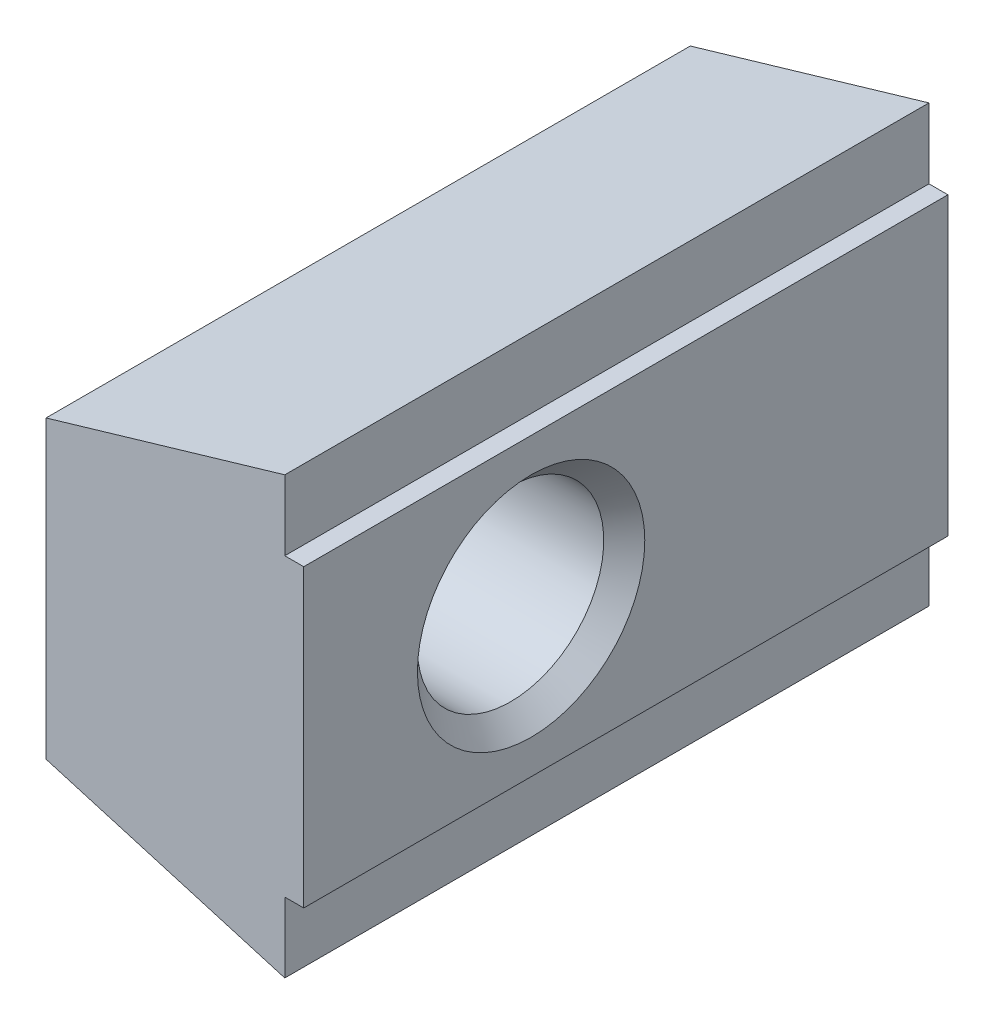
ISO-10303-21;
HEADER;
FILE_DESCRIPTION(('STEP AP214'),'2;1');
FILE_NAME('part.step','',(''),(''),'','','');
FILE_SCHEMA(('AUTOMOTIVE_DESIGN { 1 0 10303 214 1 1 1 1 }'));
ENDSEC;
DATA;
#1=APPLICATION_CONTEXT('core data for automotive mechanical design processes');
#2=APPLICATION_PROTOCOL_DEFINITION('international standard','automotive_design',2000,#1);
#3=PRODUCT_CONTEXT('',#1,'mechanical');
#4=PRODUCT('Part','Part','',(#3));
#5=PRODUCT_RELATED_PRODUCT_CATEGORY('part','',(#4));
#6=PRODUCT_DEFINITION_FORMATION('','',#4);
#7=PRODUCT_DEFINITION_CONTEXT('part definition',#1,'design');
#8=PRODUCT_DEFINITION('design','',#6,#7);
#9=PRODUCT_DEFINITION_SHAPE('','',#8);
#10=(LENGTH_UNIT() NAMED_UNIT(*) SI_UNIT(.MILLI.,.METRE.));
#11=(NAMED_UNIT(*) PLANE_ANGLE_UNIT() SI_UNIT($,.RADIAN.));
#12=(NAMED_UNIT(*) SI_UNIT($,.STERADIAN.) SOLID_ANGLE_UNIT());
#13=UNCERTAINTY_MEASURE_WITH_UNIT(LENGTH_MEASURE(1.E-05),#10,'distance_accuracy_value','');
#14=(GEOMETRIC_REPRESENTATION_CONTEXT(3) GLOBAL_UNCERTAINTY_ASSIGNED_CONTEXT((#13)) GLOBAL_UNIT_ASSIGNED_CONTEXT((#10,
#11,#12)) REPRESENTATION_CONTEXT('',''));
#15=CARTESIAN_POINT('',(0.,0.,0.));
#16=DIRECTION('',(0.,0.,1.));
#17=DIRECTION('',(1.,0.,0.));
#18=AXIS2_PLACEMENT_3D('',#15,#16,#17);
#19=CARTESIAN_POINT('',(0.,-3.9,8.5));
#20=DIRECTION('',(-1.,0.,0.));
#21=DIRECTION('',(0.,1.,0.));
#22=AXIS2_PLACEMENT_3D('',#19,#20,#21);
#23=PLANE('',#22);
#24=DIRECTION('',(0.,-1.,0.));
#25=VECTOR('',#24,1.);
#26=CARTESIAN_POINT('',(0.,3.9,-8.5));
#27=LINE('',#26,#25);
#28=CARTESIAN_POINT('',(0.,3.9,-8.5));
#29=VERTEX_POINT('',#28);
#30=CARTESIAN_POINT('',(0.,-3.9,-8.5));
#31=VERTEX_POINT('',#30);
#32=EDGE_CURVE('E88',#29,#31,#27,.T.);
#33=ORIENTED_EDGE('',*,*,#32,.T.);
#34=DIRECTION('',(0.,0.,1.));
#35=VECTOR('',#34,1.);
#36=CARTESIAN_POINT('',(0.,-3.9,-8.5));
#37=LINE('',#36,#35);
#38=CARTESIAN_POINT('',(0.,-3.9,8.5));
#39=VERTEX_POINT('',#38);
#40=EDGE_CURVE('E103',#39,#31,#37,.F.);
#41=ORIENTED_EDGE('',*,*,#40,.F.);
#42=DIRECTION('',(0.,1.,0.));
#43=VECTOR('',#42,1.);
#44=CARTESIAN_POINT('',(0.,-3.9,8.5));
#45=LINE('',#44,#43);
#46=CARTESIAN_POINT('',(0.,3.9,8.5));
#47=VERTEX_POINT('',#46);
#48=EDGE_CURVE('E110',#47,#39,#45,.F.);
#49=ORIENTED_EDGE('',*,*,#48,.F.);
#50=DIRECTION('',(0.,0.,-1.));
#51=VECTOR('',#50,1.);
#52=CARTESIAN_POINT('',(0.,3.9,8.5));
#53=LINE('',#52,#51);
#54=EDGE_CURVE('E105',#47,#29,#53,.T.);
#55=ORIENTED_EDGE('',*,*,#54,.T.);
#56=EDGE_LOOP('',(#33,#41,#49,#55));
#57=FACE_BOUND('',#56,.T.);
#58=CARTESIAN_POINT('',(0.,0.,2.5));
#59=DIRECTION('',(1.,0.,0.));
#60=DIRECTION('',(0.,0.,1.));
#61=AXIS2_PLACEMENT_3D('',#58,#59,#60);
#62=CIRCLE('',#61,3.);
#63=CARTESIAN_POINT('',(0.,0.,5.5));
#64=VERTEX_POINT('',#63);
#65=EDGE_CURVE('E121',#64,#64,#62,.T.);
#66=ORIENTED_EDGE('',*,*,#65,.T.);
#67=EDGE_LOOP('',(#66));
#68=FACE_BOUND('',#67,.T.);
#69=CARTESIAN_POINT('',(0.,-0.00084771698685834,-2.73013181840213));
#70=CARTESIAN_POINT('',(0.,-0.389533343414645,-2.73034725732706));
#71=CARTESIAN_POINT('',(0.,-0.778152090207372,-2.87873356325294));
#72=CARTESIAN_POINT('',(0.,-1.21592603360379,-3.31650750679799));
#73=CARTESIAN_POINT('',(0.,-1.32608921877815,-3.4798550101644));
#74=CARTESIAN_POINT('',(0.,-1.46378351671273,-3.81227845176298));
#75=CARTESIAN_POINT('',(0.,-1.49994597011226,-3.96080303258638));
#76=CARTESIAN_POINT('',(0.,-1.52789911810016,-4.25795648845857));
#77=CARTESIAN_POINT('',(0.,-1.51968981268853,-4.40658536350696));
#78=CARTESIAN_POINT('',(0.,-1.43228384678237,-4.83893187206593));
#79=CARTESIAN_POINT('',(0.,-1.29030913661658,-5.10910938898852));
#80=CARTESIAN_POINT('',(0.,-0.789678644676747,-5.60973988109816));
#81=CARTESIAN_POINT('',(0.,-0.403094166139054,-5.76986841523274));
#82=CARTESIAN_POINT('',(0.,0.,-5.76986841535707));
#83=B_SPLINE_CURVE_WITH_KNOTS('',3,(#69,#70,#71,#72,#73,#74,#75,#76,#77,#78,#79,#80,#81,#82),
.UNSPECIFIED.,.F.,.F.,(4,2,2,2,2,2,4),(0.,0.256980992623099,0.379352087339872,0.472765895215393,
0.566179703090914,0.753007318841956,1.),.UNSPECIFIED.);
#84=CARTESIAN_POINT('',(0.,-0.000847716986858593,-2.73013181840213));
#85=VERTEX_POINT('',#84);
#86=CARTESIAN_POINT('',(0.,0.,-5.76986841535707));
#87=VERTEX_POINT('',#86);
#88=EDGE_CURVE('E126',#85,#87,#83,.T.);
#89=ORIENTED_EDGE('',*,*,#88,.T.);
#90=CARTESIAN_POINT('',(0.,0.,-5.76986841535707));
#91=CARTESIAN_POINT('',(0.,0.403094166138927,-5.76986841523278));
#92=CARTESIAN_POINT('',(0.,0.789678644676488,-5.60973988109823));
#93=CARTESIAN_POINT('',(0.,1.21651729294736,-5.18290123268248));
#94=CARTESIAN_POINT('',(0.,1.32706600879793,-5.01874377162414));
#95=CARTESIAN_POINT('',(0.,1.4645587669039,-4.68511247390266));
#96=CARTESIAN_POINT('',(0.,1.50043543890783,-4.53669467145199));
#97=CARTESIAN_POINT('',(0.,1.52791004451991,-4.23987827339119));
#98=CARTESIAN_POINT('',(0.,1.51950797812806,-4.09147967778145));
#99=CARTESIAN_POINT('',(0.,1.43173520073492,-3.65991478595292));
#100=CARTESIAN_POINT('',(0.,1.28979791151601,-3.39037938473651));
#101=CARTESIAN_POINT('',(0.,0.777720899350654,-2.87830237239751));
#102=CARTESIAN_POINT('',(0.,0.388403054051422,-2.72991606647145));
#103=CARTESIAN_POINT('',(0.,-0.00084771698685834,-2.73013181840213));
#104=B_SPLINE_CURVE_WITH_KNOTS('',3,(#90,#91,#92,#93,#94,#95,#96,#97,#98,#99,#100,#101,#102,
#103),.UNSPECIFIED.,.F.,.F.,(4,2,2,2,2,2,4),(0.,0.246992681158043,0.369876130412482,
0.46306843777193,0.556260745131378,0.742645359850276,1.),.UNSPECIFIED.);
#105=EDGE_CURVE('E96',#87,#85,#104,.T.);
#106=ORIENTED_EDGE('',*,*,#105,.T.);
#107=EDGE_LOOP('',(#89,#106));
#108=FACE_BOUND('',#107,.T.);
#109=ADVANCED_FACE('F16',(#57,#68,#108),#23,.T.);
#110=CARTESIAN_POINT('',(6.3,-5.75,-8.5));
#111=DIRECTION('',(-0.28175402229763,-0.959486670527062,0.));
#112=DIRECTION('',(0.,0.,1.));
#113=AXIS2_PLACEMENT_3D('',#110,#111,#112);
#114=PLANE('',#113);
#115=DIRECTION('',(0.959486670527062,-0.28175402229763,0.));
#116=VECTOR('',#115,1.);
#117=CARTESIAN_POINT('',(0.,-3.9,-8.5));
#118=LINE('',#117,#116);
#119=CARTESIAN_POINT('',(6.3,-5.75,-8.5));
#120=VERTEX_POINT('',#119);
#121=EDGE_CURVE('E85',#31,#120,#118,.T.);
#122=ORIENTED_EDGE('',*,*,#121,.T.);
#123=DIRECTION('',(0.,0.,1.));
#124=VECTOR('',#123,1.);
#125=CARTESIAN_POINT('',(6.3,-5.75,-8.5));
#126=LINE('',#125,#124);
#127=CARTESIAN_POINT('',(6.3,-5.75,8.5));
#128=VERTEX_POINT('',#127);
#129=EDGE_CURVE('E95',#128,#120,#126,.F.);
#130=ORIENTED_EDGE('',*,*,#129,.F.);
#131=DIRECTION('',(-0.959486670527062,0.28175402229763,0.));
#132=VECTOR('',#131,1.);
#133=CARTESIAN_POINT('',(6.3,-5.75,8.5));
#134=LINE('',#133,#132);
#135=EDGE_CURVE('E109',#39,#128,#134,.F.);
#136=ORIENTED_EDGE('',*,*,#135,.F.);
#137=ORIENTED_EDGE('',*,*,#40,.T.);
#138=EDGE_LOOP('',(#122,#130,#136,#137));
#139=FACE_BOUND('',#138,.T.);
#140=ADVANCED_FACE('F108',(#139),#114,.T.);
#141=CARTESIAN_POINT('',(6.3,-5.75,-8.5));
#142=DIRECTION('',(1.,0.,0.));
#143=DIRECTION('',(0.,1.,0.));
#144=AXIS2_PLACEMENT_3D('',#141,#142,#143);
#145=PLANE('',#144);
#146=DIRECTION('',(0.,1.,0.));
#147=VECTOR('',#146,1.);
#148=CARTESIAN_POINT('',(6.3,-5.75,-8.5));
#149=LINE('',#148,#147);
#150=CARTESIAN_POINT('',(6.3,-3.9,-8.5));
#151=VERTEX_POINT('',#150);
#152=EDGE_CURVE('E90',#120,#151,#149,.T.);
#153=ORIENTED_EDGE('',*,*,#152,.T.);
#154=DIRECTION('',(0.,0.,1.));
#155=VECTOR('',#154,1.);
#156=CARTESIAN_POINT('',(6.3,-3.9,-8.5));
#157=LINE('',#156,#155);
#158=CARTESIAN_POINT('',(6.3,-3.9,8.5));
#159=VERTEX_POINT('',#158);
#160=EDGE_CURVE('E163',#159,#151,#157,.F.);
#161=ORIENTED_EDGE('',*,*,#160,.F.);
#162=DIRECTION('',(0.,-1.,0.));
#163=VECTOR('',#162,1.);
#164=CARTESIAN_POINT('',(6.3,-3.9,8.5));
#165=LINE('',#164,#163);
#166=EDGE_CURVE('E168',#128,#159,#165,.F.);
#167=ORIENTED_EDGE('',*,*,#166,.F.);
#168=ORIENTED_EDGE('',*,*,#129,.T.);
#169=EDGE_LOOP('',(#153,#161,#167,#168));
#170=FACE_BOUND('',#169,.T.);
#171=ADVANCED_FACE('F340',(#170),#145,.T.);
#172=CARTESIAN_POINT('',(6.3,-3.9,-8.5));
#173=DIRECTION('',(0.,-1.,0.));
#174=DIRECTION('',(1.,0.,0.));
#175=AXIS2_PLACEMENT_3D('',#172,#173,#174);
#176=PLANE('',#175);
#177=DIRECTION('',(1.,0.,0.));
#178=VECTOR('',#177,1.);
#179=CARTESIAN_POINT('',(6.3,-3.9,-8.5));
#180=LINE('',#179,#178);
#181=CARTESIAN_POINT('',(6.8,-3.9,-8.5));
#182=VERTEX_POINT('',#181);
#183=EDGE_CURVE('E172',#151,#182,#180,.T.);
#184=ORIENTED_EDGE('',*,*,#183,.T.);
#185=DIRECTION('',(0.,0.,1.));
#186=VECTOR('',#185,1.);
#187=CARTESIAN_POINT('',(6.8,-3.9,-8.5));
#188=LINE('',#187,#186);
#189=CARTESIAN_POINT('',(6.8,-3.9,8.5));
#190=VERTEX_POINT('',#189);
#191=EDGE_CURVE('E177',#190,#182,#188,.F.);
#192=ORIENTED_EDGE('',*,*,#191,.F.);
#193=DIRECTION('',(-1.,0.,0.));
#194=VECTOR('',#193,1.);
#195=CARTESIAN_POINT('',(6.8,-3.9,8.5));
#196=LINE('',#195,#194);
#197=EDGE_CURVE('E182',#159,#190,#196,.F.);
#198=ORIENTED_EDGE('',*,*,#197,.F.);
#199=ORIENTED_EDGE('',*,*,#160,.T.);
#200=EDGE_LOOP('',(#184,#192,#198,#199));
#201=FACE_BOUND('',#200,.T.);
#202=ADVANCED_FACE('F332',(#201),#176,.T.);
#203=CARTESIAN_POINT('',(6.8,-3.9,-8.5));
#204=DIRECTION('',(1.,0.,0.));
#205=DIRECTION('',(0.,1.,0.));
#206=AXIS2_PLACEMENT_3D('',#203,#204,#205);
#207=PLANE('',#206);
#208=DIRECTION('',(0.,1.,0.));
#209=VECTOR('',#208,1.);
#210=CARTESIAN_POINT('',(6.8,-3.9,-8.5));
#211=LINE('',#210,#209);
#212=CARTESIAN_POINT('',(6.8,3.9,-8.5));
#213=VERTEX_POINT('',#212);
#214=EDGE_CURVE('E186',#182,#213,#211,.T.);
#215=ORIENTED_EDGE('',*,*,#214,.T.);
#216=DIRECTION('',(0.,0.,1.));
#217=VECTOR('',#216,1.);
#218=CARTESIAN_POINT('',(6.8,3.9,-8.5));
#219=LINE('',#218,#217);
#220=CARTESIAN_POINT('',(6.8,3.9,8.5));
#221=VERTEX_POINT('',#220);
#222=EDGE_CURVE('E191',#221,#213,#219,.F.);
#223=ORIENTED_EDGE('',*,*,#222,.F.);
#224=DIRECTION('',(0.,-1.,0.));
#225=VECTOR('',#224,1.);
#226=CARTESIAN_POINT('',(6.8,3.9,8.5));
#227=LINE('',#226,#225);
#228=EDGE_CURVE('E196',#190,#221,#227,.F.);
#229=ORIENTED_EDGE('',*,*,#228,.F.);
#230=ORIENTED_EDGE('',*,*,#191,.T.);
#231=EDGE_LOOP('',(#215,#223,#229,#230));
#232=FACE_BOUND('',#231,.T.);
#233=CARTESIAN_POINT('',(6.8,0.,2.5));
#234=DIRECTION('',(-1.,0.,0.));
#235=DIRECTION('',(0.,0.,-1.));
#236=AXIS2_PLACEMENT_3D('',#233,#234,#235);
#237=CIRCLE('',#236,3.);
#238=CARTESIAN_POINT('',(6.8,0.,-0.500000000000001));
#239=VERTEX_POINT('',#238);
#240=EDGE_CURVE('E200',#239,#239,#237,.F.);
#241=ORIENTED_EDGE('',*,*,#240,.F.);
#242=EDGE_LOOP('',(#241));
#243=FACE_BOUND('',#242,.T.);
#244=ADVANCED_FACE('F324',(#232,#243),#207,.T.);
#245=CARTESIAN_POINT('',(6.3,3.9,8.5));
#246=DIRECTION('',(0.,1.,0.));
#247=DIRECTION('',(1.,0.,0.));
#248=AXIS2_PLACEMENT_3D('',#245,#246,#247);
#249=PLANE('',#248);
#250=DIRECTION('',(-1.,0.,0.));
#251=VECTOR('',#250,1.);
#252=CARTESIAN_POINT('',(6.8,3.9,-8.5));
#253=LINE('',#252,#251);
#254=CARTESIAN_POINT('',(6.3,3.9,-8.5));
#255=VERTEX_POINT('',#254);
#256=EDGE_CURVE('E205',#213,#255,#253,.T.);
#257=ORIENTED_EDGE('',*,*,#256,.T.);
#258=DIRECTION('',(0.,0.,1.));
#259=VECTOR('',#258,1.);
#260=CARTESIAN_POINT('',(6.3,3.9,-8.5));
#261=LINE('',#260,#259);
#262=CARTESIAN_POINT('',(6.3,3.9,8.5));
#263=VERTEX_POINT('',#262);
#264=EDGE_CURVE('E208',#263,#255,#261,.F.);
#265=ORIENTED_EDGE('',*,*,#264,.F.);
#266=DIRECTION('',(1.,0.,0.));
#267=VECTOR('',#266,1.);
#268=CARTESIAN_POINT('',(6.3,3.9,8.5));
#269=LINE('',#268,#267);
#270=EDGE_CURVE('E213',#221,#263,#269,.F.);
#271=ORIENTED_EDGE('',*,*,#270,.F.);
#272=ORIENTED_EDGE('',*,*,#222,.T.);
#273=EDGE_LOOP('',(#257,#265,#271,#272));
#274=FACE_BOUND('',#273,.T.);
#275=ADVANCED_FACE('F316',(#274),#249,.T.);
#276=CARTESIAN_POINT('',(6.3,3.9,-8.5));
#277=DIRECTION('',(1.,0.,0.));
#278=DIRECTION('',(0.,1.,0.));
#279=AXIS2_PLACEMENT_3D('',#276,#277,#278);
#280=PLANE('',#279);
#281=DIRECTION('',(0.,1.,0.));
#282=VECTOR('',#281,1.);
#283=CARTESIAN_POINT('',(6.3,3.9,-8.5));
#284=LINE('',#283,#282);
#285=CARTESIAN_POINT('',(6.3,5.75,-8.5));
#286=VERTEX_POINT('',#285);
#287=EDGE_CURVE('E217',#255,#286,#284,.T.);
#288=ORIENTED_EDGE('',*,*,#287,.T.);
#289=DIRECTION('',(0.,0.,1.));
#290=VECTOR('',#289,1.);
#291=CARTESIAN_POINT('',(6.3,5.75,-8.5));
#292=LINE('',#291,#290);
#293=CARTESIAN_POINT('',(6.3,5.75,8.5));
#294=VERTEX_POINT('',#293);
#295=EDGE_CURVE('E221',#294,#286,#292,.F.);
#296=ORIENTED_EDGE('',*,*,#295,.F.);
#297=DIRECTION('',(0.,-1.,0.));
#298=VECTOR('',#297,1.);
#299=CARTESIAN_POINT('',(6.3,5.75,8.5));
#300=LINE('',#299,#298);
#301=EDGE_CURVE('E31',#263,#294,#300,.F.);
#302=ORIENTED_EDGE('',*,*,#301,.F.);
#303=ORIENTED_EDGE('',*,*,#264,.T.);
#304=EDGE_LOOP('',(#288,#296,#302,#303));
#305=FACE_BOUND('',#304,.T.);
#306=ADVANCED_FACE('F308',(#305),#280,.T.);
#307=CARTESIAN_POINT('',(0.,3.9,-8.5));
#308=DIRECTION('',(-0.28175402229763,0.959486670527062,0.));
#309=DIRECTION('',(0.,0.,1.));
#310=AXIS2_PLACEMENT_3D('',#307,#308,#309);
#311=PLANE('',#310);
#312=DIRECTION('',(-0.959486670527062,-0.281754022297629,0.));
#313=VECTOR('',#312,1.);
#314=CARTESIAN_POINT('',(6.3,5.75,-8.5));
#315=LINE('',#314,#313);
#316=EDGE_CURVE('E39',#286,#29,#315,.T.);
#317=ORIENTED_EDGE('',*,*,#316,.T.);
#318=ORIENTED_EDGE('',*,*,#54,.F.);
#319=DIRECTION('',(0.959486670527062,0.281754022297629,0.));
#320=VECTOR('',#319,1.);
#321=CARTESIAN_POINT('',(0.,3.9,8.5));
#322=LINE('',#321,#320);
#323=EDGE_CURVE('E232',#294,#47,#322,.F.);
#324=ORIENTED_EDGE('',*,*,#323,.F.);
#325=ORIENTED_EDGE('',*,*,#295,.T.);
#326=EDGE_LOOP('',(#317,#318,#324,#325));
#327=FACE_BOUND('',#326,.T.);
#328=ADVANCED_FACE('F302',(#327),#311,.T.);
#329=CARTESIAN_POINT('',(0.,-5.75,8.5));
#330=DIRECTION('',(0.,0.,1.));
#331=DIRECTION('',(1.,0.,0.));
#332=AXIS2_PLACEMENT_3D('',#329,#330,#331);
#333=PLANE('',#332);
#334=ORIENTED_EDGE('',*,*,#48,.T.);
#335=ORIENTED_EDGE('',*,*,#135,.T.);
#336=ORIENTED_EDGE('',*,*,#166,.T.);
#337=ORIENTED_EDGE('',*,*,#197,.T.);
#338=ORIENTED_EDGE('',*,*,#228,.T.);
#339=ORIENTED_EDGE('',*,*,#270,.T.);
#340=ORIENTED_EDGE('',*,*,#301,.T.);
#341=ORIENTED_EDGE('',*,*,#323,.T.);
#342=EDGE_LOOP('',(#334,#335,#336,#337,#338,#339,#340,#341));
#343=FACE_BOUND('',#342,.T.);
#344=ADVANCED_FACE('F296',(#343),#333,.T.);
#345=CARTESIAN_POINT('',(0.,-5.75,-8.5));
#346=DIRECTION('',(0.,0.,-1.));
#347=DIRECTION('',(0.,1.,0.));
#348=AXIS2_PLACEMENT_3D('',#345,#346,#347);
#349=PLANE('',#348);
#350=ORIENTED_EDGE('',*,*,#32,.F.);
#351=ORIENTED_EDGE('',*,*,#316,.F.);
#352=ORIENTED_EDGE('',*,*,#287,.F.);
#353=ORIENTED_EDGE('',*,*,#256,.F.);
#354=ORIENTED_EDGE('',*,*,#214,.F.);
#355=ORIENTED_EDGE('',*,*,#183,.F.);
#356=ORIENTED_EDGE('',*,*,#152,.F.);
#357=ORIENTED_EDGE('',*,*,#121,.F.);
#358=EDGE_LOOP('',(#350,#351,#352,#353,#354,#355,#356,#357));
#359=FACE_BOUND('',#358,.T.);
#360=ADVANCED_FACE('F87',(#359),#349,.T.);
#361=CARTESIAN_POINT('',(1.3,0.,-4.25));
#362=DIRECTION('',(0.,1.,0.));
#363=DIRECTION('',(-0.649999999884393,0.,-0.759934207777416));
#364=AXIS2_PLACEMENT_3D('',#361,#362,#363);
#365=SPHERICAL_SURFACE('',#364,2.);
#366=ORIENTED_EDGE('',*,*,#105,.F.);
#367=ORIENTED_EDGE('',*,*,#88,.F.);
#368=EDGE_LOOP('',(#366,#367));
#369=FACE_BOUND('',#368,.T.);
#370=ADVANCED_FACE('F245',(#369),#365,.T.);
#371=CARTESIAN_POINT('',(0.,0.,2.5));
#372=DIRECTION('',(-1.,0.,0.));
#373=DIRECTION('',(0.,0.,-1.));
#374=AXIS2_PLACEMENT_3D('',#371,#372,#373);
#375=CONICAL_SURFACE('',#374,3.,0.785398163397448);
#376=ORIENTED_EDGE('',*,*,#65,.F.);
#377=EDGE_LOOP('',(#376));
#378=FACE_BOUND('',#377,.T.);
#379=CARTESIAN_POINT('',(0.5415,0.,2.5));
#380=DIRECTION('',(1.,0.,0.));
#381=DIRECTION('',(0.,0.,1.));
#382=AXIS2_PLACEMENT_3D('',#379,#380,#381);
#383=CIRCLE('',#382,2.4585);
#384=CARTESIAN_POINT('',(0.5415,0.,4.9585));
#385=VERTEX_POINT('',#384);
#386=EDGE_CURVE('E24',#385,#385,#383,.T.);
#387=ORIENTED_EDGE('',*,*,#386,.T.);
#388=EDGE_LOOP('',(#387));
#389=FACE_BOUND('',#388,.T.);
#390=ADVANCED_FACE('F255',(#378,#389),#375,.F.);
#391=CARTESIAN_POINT('',(6.8,0.,2.5));
#392=DIRECTION('',(1.,0.,0.));
#393=DIRECTION('',(0.,0.,1.));
#394=AXIS2_PLACEMENT_3D('',#391,#392,#393);
#395=CYLINDRICAL_SURFACE('',#394,2.4585);
#396=CARTESIAN_POINT('',(6.2585,0.,2.5));
#397=DIRECTION('',(1.,0.,0.));
#398=DIRECTION('',(0.,0.,1.));
#399=AXIS2_PLACEMENT_3D('',#396,#397,#398);
#400=CIRCLE('',#399,2.4585);
#401=CARTESIAN_POINT('',(6.2585,0.,4.9585));
#402=VERTEX_POINT('',#401);
#403=EDGE_CURVE('E11',#402,#402,#400,.T.);
#404=ORIENTED_EDGE('',*,*,#403,.T.);
#405=EDGE_LOOP('',(#404));
#406=FACE_BOUND('',#405,.T.);
#407=ORIENTED_EDGE('',*,*,#386,.F.);
#408=EDGE_LOOP('',(#407));
#409=FACE_BOUND('',#408,.T.);
#410=ADVANCED_FACE('F269',(#406,#409),#395,.F.);
#411=CARTESIAN_POINT('',(6.8,0.,2.5));
#412=DIRECTION('',(1.,0.,0.));
#413=DIRECTION('',(0.,1.42053894547696E-07,0.99999999999999));
#414=AXIS2_PLACEMENT_3D('',#411,#412,#413);
#415=CONICAL_SURFACE('',#414,3.,0.785398163397449);
#416=ORIENTED_EDGE('',*,*,#240,.T.);
#417=EDGE_LOOP('',(#416));
#418=FACE_BOUND('',#417,.T.);
#419=ORIENTED_EDGE('',*,*,#403,.F.);
#420=EDGE_LOOP('',(#419));
#421=FACE_BOUND('',#420,.T.);
#422=ADVANCED_FACE('F18',(#418,#421),#415,.F.);
#423=CLOSED_SHELL('',(#109,#140,#171,#202,#244,#275,#306,#328,#344,#360,#370,#390,#410,#422));
#424=MANIFOLD_SOLID_BREP('B1',#423);
#425=ADVANCED_BREP_SHAPE_REPRESENTATION('',(#18,#424),#14);
#426=SHAPE_DEFINITION_REPRESENTATION(#9,#425);
ENDSEC;
END-ISO-10303-21;
